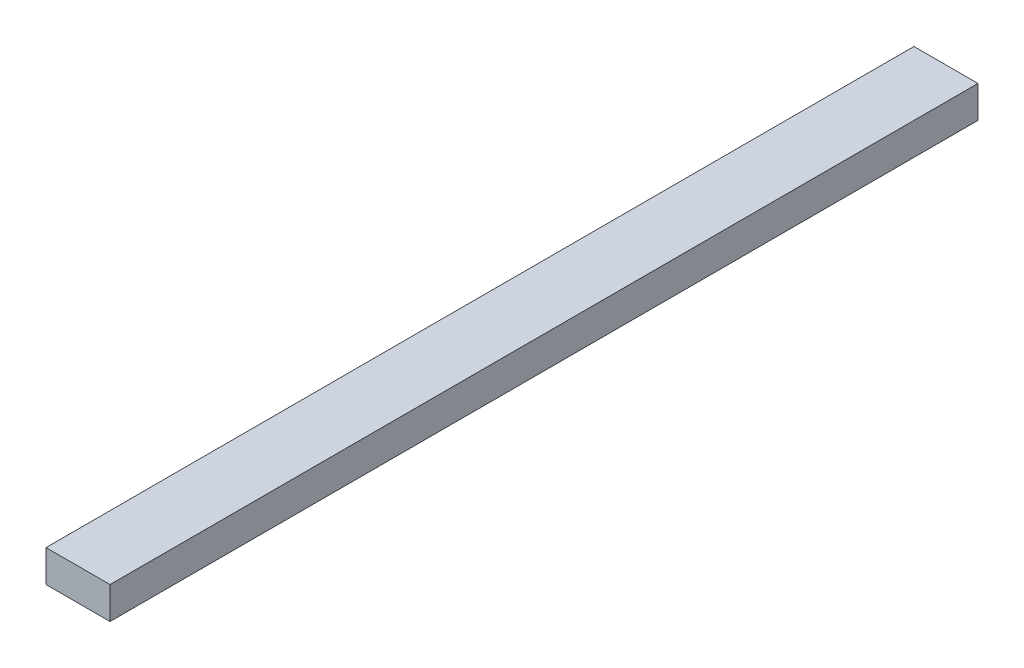
ISO-10303-21;
HEADER;
FILE_DESCRIPTION(('STEP AP214'),'2;1');
FILE_NAME('part.step','',(''),(''),'','','');
FILE_SCHEMA(('AUTOMOTIVE_DESIGN { 1 0 10303 214 1 1 1 1 }'));
ENDSEC;
DATA;
#1=APPLICATION_CONTEXT('core data for automotive mechanical design processes');
#2=APPLICATION_PROTOCOL_DEFINITION('international standard','automotive_design',2000,#1);
#3=PRODUCT_CONTEXT('',#1,'mechanical');
#4=PRODUCT('Part','Part','',(#3));
#5=PRODUCT_RELATED_PRODUCT_CATEGORY('part','',(#4));
#6=PRODUCT_DEFINITION_FORMATION('','',#4);
#7=PRODUCT_DEFINITION_CONTEXT('part definition',#1,'design');
#8=PRODUCT_DEFINITION('design','',#6,#7);
#9=PRODUCT_DEFINITION_SHAPE('','',#8);
#10=(LENGTH_UNIT() NAMED_UNIT(*) SI_UNIT(.MILLI.,.METRE.));
#11=(NAMED_UNIT(*) PLANE_ANGLE_UNIT() SI_UNIT($,.RADIAN.));
#12=(NAMED_UNIT(*) SI_UNIT($,.STERADIAN.) SOLID_ANGLE_UNIT());
#13=UNCERTAINTY_MEASURE_WITH_UNIT(LENGTH_MEASURE(1.E-05),#10,'distance_accuracy_value','');
#14=(GEOMETRIC_REPRESENTATION_CONTEXT(3) GLOBAL_UNCERTAINTY_ASSIGNED_CONTEXT((#13)) GLOBAL_UNIT_ASSIGNED_CONTEXT((#10,
#11,#12)) REPRESENTATION_CONTEXT('',''));
#15=CARTESIAN_POINT('',(0.,0.,0.));
#16=DIRECTION('',(0.,0.,1.));
#17=DIRECTION('',(1.,0.,0.));
#18=AXIS2_PLACEMENT_3D('',#15,#16,#17);
#19=CARTESIAN_POINT('',(0.,0.,542.2));
#20=DIRECTION('',(1.,0.,0.));
#21=DIRECTION('',(0.,1.,0.));
#22=AXIS2_PLACEMENT_3D('',#19,#20,#21);
#23=PLANE('',#22);
#24=DIRECTION('',(0.,-1.,0.));
#25=VECTOR('',#24,1.);
#26=CARTESIAN_POINT('',(0.,0.,0.));
#27=LINE('',#26,#25);
#28=CARTESIAN_POINT('',(0.,20.,0.));
#29=VERTEX_POINT('',#28);
#30=CARTESIAN_POINT('',(0.,0.,0.));
#31=VERTEX_POINT('',#30);
#32=EDGE_CURVE('E96',#29,#31,#27,.T.);
#33=ORIENTED_EDGE('',*,*,#32,.T.);
#34=DIRECTION('',(0.,0.,-1.));
#35=VECTOR('',#34,1.);
#36=CARTESIAN_POINT('',(0.,0.,542.2));
#37=LINE('',#36,#35);
#38=CARTESIAN_POINT('',(0.,0.,542.2));
#39=VERTEX_POINT('',#38);
#40=EDGE_CURVE('E11',#39,#31,#37,.T.);
#41=ORIENTED_EDGE('',*,*,#40,.F.);
#42=DIRECTION('',(0.,-1.,0.));
#43=VECTOR('',#42,1.);
#44=CARTESIAN_POINT('',(0.,0.,542.2));
#45=LINE('',#44,#43);
#46=CARTESIAN_POINT('',(0.,20.,542.2));
#47=VERTEX_POINT('',#46);
#48=EDGE_CURVE('E84',#47,#39,#45,.T.);
#49=ORIENTED_EDGE('',*,*,#48,.F.);
#50=DIRECTION('',(0.,0.,-1.));
#51=VECTOR('',#50,1.);
#52=CARTESIAN_POINT('',(0.,20.,542.2));
#53=LINE('',#52,#51);
#54=EDGE_CURVE('E92',#47,#29,#53,.T.);
#55=ORIENTED_EDGE('',*,*,#54,.T.);
#56=EDGE_LOOP('',(#33,#41,#49,#55));
#57=FACE_BOUND('',#56,.T.);
#58=ADVANCED_FACE('F33',(#57),#23,.F.);
#59=CARTESIAN_POINT('',(0.,0.,542.2));
#60=DIRECTION('',(0.,1.,0.));
#61=DIRECTION('',(0.,0.,1.));
#62=AXIS2_PLACEMENT_3D('',#59,#60,#61);
#63=PLANE('',#62);
#64=DIRECTION('',(1.,0.,0.));
#65=VECTOR('',#64,1.);
#66=CARTESIAN_POINT('',(0.,0.,0.));
#67=LINE('',#66,#65);
#68=CARTESIAN_POINT('',(40.,0.,0.));
#69=VERTEX_POINT('',#68);
#70=EDGE_CURVE('E88',#31,#69,#67,.T.);
#71=ORIENTED_EDGE('',*,*,#70,.T.);
#72=DIRECTION('',(0.,0.,-1.));
#73=VECTOR('',#72,1.);
#74=CARTESIAN_POINT('',(40.,0.,542.2));
#75=LINE('',#74,#73);
#76=CARTESIAN_POINT('',(40.,0.,542.2));
#77=VERTEX_POINT('',#76);
#78=EDGE_CURVE('E41',#77,#69,#75,.T.);
#79=ORIENTED_EDGE('',*,*,#78,.F.);
#80=DIRECTION('',(1.,0.,0.));
#81=VECTOR('',#80,1.);
#82=CARTESIAN_POINT('',(0.,0.,542.2));
#83=LINE('',#82,#81);
#84=EDGE_CURVE('E79',#39,#77,#83,.T.);
#85=ORIENTED_EDGE('',*,*,#84,.F.);
#86=ORIENTED_EDGE('',*,*,#40,.T.);
#87=EDGE_LOOP('',(#71,#79,#85,#86));
#88=FACE_BOUND('',#87,.T.);
#89=ADVANCED_FACE('F87',(#88),#63,.F.);
#90=CARTESIAN_POINT('',(40.,0.,542.2));
#91=DIRECTION('',(-1.,0.,0.));
#92=DIRECTION('',(0.,-1.,0.));
#93=AXIS2_PLACEMENT_3D('',#90,#91,#92);
#94=PLANE('',#93);
#95=DIRECTION('',(0.,1.,0.));
#96=VECTOR('',#95,1.);
#97=CARTESIAN_POINT('',(40.,0.,0.));
#98=LINE('',#97,#96);
#99=CARTESIAN_POINT('',(40.,20.,0.));
#100=VERTEX_POINT('',#99);
#101=EDGE_CURVE('E66',#69,#100,#98,.T.);
#102=ORIENTED_EDGE('',*,*,#101,.T.);
#103=DIRECTION('',(0.,0.,-1.));
#104=VECTOR('',#103,1.);
#105=CARTESIAN_POINT('',(40.,20.,542.2));
#106=LINE('',#105,#104);
#107=CARTESIAN_POINT('',(40.,20.,542.2));
#108=VERTEX_POINT('',#107);
#109=EDGE_CURVE('E89',#108,#100,#106,.T.);
#110=ORIENTED_EDGE('',*,*,#109,.F.);
#111=DIRECTION('',(0.,1.,0.));
#112=VECTOR('',#111,1.);
#113=CARTESIAN_POINT('',(40.,0.,542.2));
#114=LINE('',#113,#112);
#115=EDGE_CURVE('E82',#77,#108,#114,.T.);
#116=ORIENTED_EDGE('',*,*,#115,.F.);
#117=ORIENTED_EDGE('',*,*,#78,.T.);
#118=EDGE_LOOP('',(#102,#110,#116,#117));
#119=FACE_BOUND('',#118,.T.);
#120=ADVANCED_FACE('F90',(#119),#94,.F.);
#121=CARTESIAN_POINT('',(0.,20.,542.2));
#122=DIRECTION('',(0.,-1.,0.));
#123=DIRECTION('',(0.,0.,-1.));
#124=AXIS2_PLACEMENT_3D('',#121,#122,#123);
#125=PLANE('',#124);
#126=DIRECTION('',(-1.,0.,0.));
#127=VECTOR('',#126,1.);
#128=CARTESIAN_POINT('',(0.,20.,0.));
#129=LINE('',#128,#127);
#130=EDGE_CURVE('E72',#100,#29,#129,.T.);
#131=ORIENTED_EDGE('',*,*,#130,.T.);
#132=ORIENTED_EDGE('',*,*,#54,.F.);
#133=DIRECTION('',(-1.,0.,0.));
#134=VECTOR('',#133,1.);
#135=CARTESIAN_POINT('',(0.,20.,542.2));
#136=LINE('',#135,#134);
#137=EDGE_CURVE('E49',#108,#47,#136,.T.);
#138=ORIENTED_EDGE('',*,*,#137,.F.);
#139=ORIENTED_EDGE('',*,*,#109,.T.);
#140=EDGE_LOOP('',(#131,#132,#138,#139));
#141=FACE_BOUND('',#140,.T.);
#142=ADVANCED_FACE('F103',(#141),#125,.F.);
#143=CARTESIAN_POINT('',(0.,0.,542.2));
#144=DIRECTION('',(0.,0.,-1.));
#145=DIRECTION('',(-1.,0.,0.));
#146=AXIS2_PLACEMENT_3D('',#143,#144,#145);
#147=PLANE('',#146);
#148=ORIENTED_EDGE('',*,*,#48,.T.);
#149=ORIENTED_EDGE('',*,*,#84,.T.);
#150=ORIENTED_EDGE('',*,*,#115,.T.);
#151=ORIENTED_EDGE('',*,*,#137,.T.);
#152=EDGE_LOOP('',(#148,#149,#150,#151));
#153=FACE_BOUND('',#152,.T.);
#154=ADVANCED_FACE('F80',(#153),#147,.F.);
#155=CARTESIAN_POINT('',(0.,0.,0.));
#156=DIRECTION('',(0.,0.,-1.));
#157=DIRECTION('',(-1.,0.,0.));
#158=AXIS2_PLACEMENT_3D('',#155,#156,#157);
#159=PLANE('',#158);
#160=ORIENTED_EDGE('',*,*,#32,.F.);
#161=ORIENTED_EDGE('',*,*,#130,.F.);
#162=ORIENTED_EDGE('',*,*,#101,.F.);
#163=ORIENTED_EDGE('',*,*,#70,.F.);
#164=EDGE_LOOP('',(#160,#161,#162,#163));
#165=FACE_BOUND('',#164,.T.);
#166=ADVANCED_FACE('F106',(#165),#159,.T.);
#167=CLOSED_SHELL('',(#58,#89,#120,#142,#154,#166));
#168=MANIFOLD_SOLID_BREP('B2',#167);
#169=ADVANCED_BREP_SHAPE_REPRESENTATION('',(#18,#168),#14);
#170=SHAPE_DEFINITION_REPRESENTATION(#9,#169);
ENDSEC;
END-ISO-10303-21;
